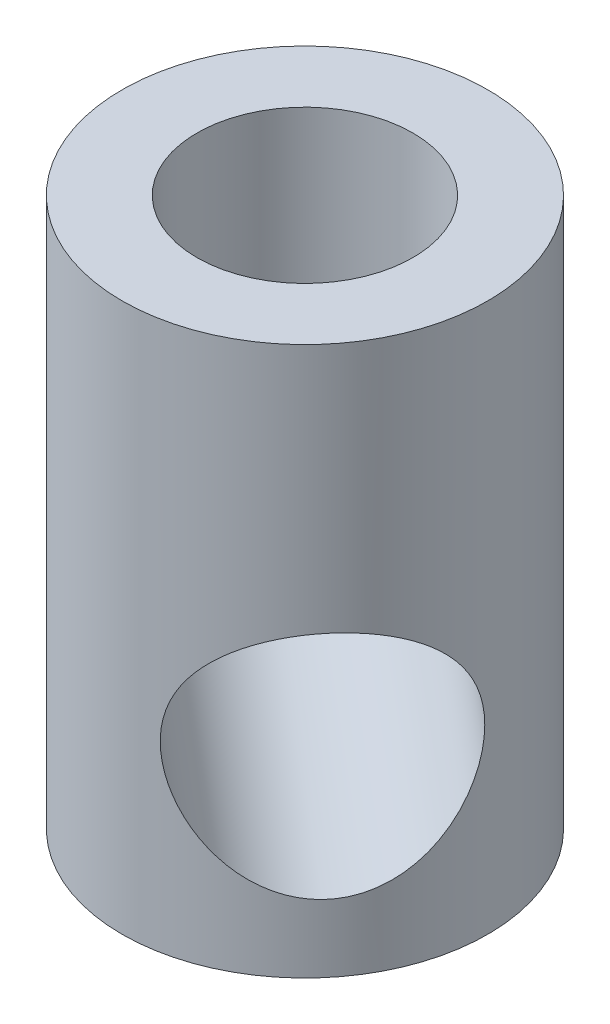
ISO-10303-21;
HEADER;
FILE_DESCRIPTION(('STEP AP214'),'2;1');
FILE_NAME('part.step','',(''),(''),'','','');
FILE_SCHEMA(('AUTOMOTIVE_DESIGN { 1 0 10303 214 1 1 1 1 }'));
ENDSEC;
DATA;
#1=APPLICATION_CONTEXT('core data for automotive mechanical design processes');
#2=APPLICATION_PROTOCOL_DEFINITION('international standard','automotive_design',2000,#1);
#3=PRODUCT_CONTEXT('',#1,'mechanical');
#4=PRODUCT('Part','Part','',(#3));
#5=PRODUCT_RELATED_PRODUCT_CATEGORY('part','',(#4));
#6=PRODUCT_DEFINITION_FORMATION('','',#4);
#7=PRODUCT_DEFINITION_CONTEXT('part definition',#1,'design');
#8=PRODUCT_DEFINITION('design','',#6,#7);
#9=PRODUCT_DEFINITION_SHAPE('','',#8);
#10=(LENGTH_UNIT() NAMED_UNIT(*) SI_UNIT(.MILLI.,.METRE.));
#11=(NAMED_UNIT(*) PLANE_ANGLE_UNIT() SI_UNIT($,.RADIAN.));
#12=(NAMED_UNIT(*) SI_UNIT($,.STERADIAN.) SOLID_ANGLE_UNIT());
#13=UNCERTAINTY_MEASURE_WITH_UNIT(LENGTH_MEASURE(1.E-05),#10,'distance_accuracy_value','');
#14=(GEOMETRIC_REPRESENTATION_CONTEXT(3) GLOBAL_UNCERTAINTY_ASSIGNED_CONTEXT((#13)) GLOBAL_UNIT_ASSIGNED_CONTEXT((#10,
#11,#12)) REPRESENTATION_CONTEXT('',''));
#15=CARTESIAN_POINT('',(0.,0.,0.));
#16=DIRECTION('',(0.,0.,1.));
#17=DIRECTION('',(1.,0.,0.));
#18=AXIS2_PLACEMENT_3D('',#15,#16,#17);
#19=CARTESIAN_POINT('',(0.,76.2,0.));
#20=DIRECTION('',(0.,-1.,0.));
#21=DIRECTION('',(0.,0.,-1.));
#22=AXIS2_PLACEMENT_3D('',#19,#20,#21);
#23=CYLINDRICAL_SURFACE('',#22,25.4);
#24=CARTESIAN_POINT('',(-4.83356462815564,25.4,-24.9358507572018));
#25=CARTESIAN_POINT('',(-4.83357110868938,25.7969701139524,-24.9358516920999));
#26=CARTESIAN_POINT('',(-4.85229699139434,26.1939988397188,-24.9322421428112));
#27=CARTESIAN_POINT('',(-4.92660675670398,26.9846220584306,-24.9176629867704));
#28=CARTESIAN_POINT('',(-4.98221122666198,27.3782145086725,-24.9066892689545));
#29=CARTESIAN_POINT('',(-5.1286808126733,28.1593589895148,-24.8769411940413));
#30=CARTESIAN_POINT('',(-5.21962459802844,28.5468955226079,-24.8581494264433));
#31=CARTESIAN_POINT('',(-5.43412762537878,29.3122231946948,-24.8121391128153));
#32=CARTESIAN_POINT('',(-5.55768383995179,29.6900152347016,-24.7849213489326));
#33=CARTESIAN_POINT('',(-5.83308184477297,30.4304631129457,-24.7215475140373));
#34=CARTESIAN_POINT('',(-5.98466226425741,30.793223694934,-24.6854731011177));
#35=CARTESIAN_POINT('',(-6.31368416263039,31.5056677590574,-24.6033762988365));
#36=CARTESIAN_POINT('',(-6.49112940940701,31.85534932655,-24.5573524596084));
#37=CARTESIAN_POINT('',(-6.86875277072241,32.5404197543147,-24.4544170263019));
#38=CARTESIAN_POINT('',(-7.06892660011471,32.8758112924216,-24.3975074831855));
#39=CARTESIAN_POINT('',(-7.4891621917344,33.5315565054309,-24.2718057514499));
#40=CARTESIAN_POINT('',(-7.70922514024445,33.8519092816155,-24.2030128538269));
#41=CARTESIAN_POINT('',(-8.19784664213237,34.5195857603469,-24.0422578217027));
#42=CARTESIAN_POINT('',(-8.46892352195738,34.8646165945116,-23.948414454026));
#43=CARTESIAN_POINT('',(-9.0298188052743,35.5333887068003,-23.7426121334703));
#44=CARTESIAN_POINT('',(-9.31963840772424,35.8571286202829,-23.6306520209872));
#45=CARTESIAN_POINT('',(-9.91501776064366,36.4825181563404,-23.387089334142));
#46=CARTESIAN_POINT('',(-10.2205902711803,36.7841493760242,-23.2554706670264));
#47=CARTESIAN_POINT('',(-10.8441881440258,37.3637986446783,-22.971308480158));
#48=CARTESIAN_POINT('',(-11.1622142306806,37.64181531715,-22.8187637419721));
#49=CARTESIAN_POINT('',(-11.8476176693465,38.2055924750291,-22.4712972093967));
#50=CARTESIAN_POINT('',(-12.2162384320263,38.4880671533355,-22.2734683612964));
#51=CARTESIAN_POINT('',(-12.9611157483304,39.0189561546074,-21.8484177778527));
#52=CARTESIAN_POINT('',(-13.3373730874943,39.2673669529827,-21.6211930056328));
#53=CARTESIAN_POINT('',(-14.0926789533767,39.7271905766952,-21.1366395540882));
#54=CARTESIAN_POINT('',(-14.4717251367174,39.9386314287114,-20.879333927968));
#55=CARTESIAN_POINT('',(-15.2280272156126,40.321809162218,-20.3343132081772));
#56=CARTESIAN_POINT('',(-15.6052834304611,40.4935534072534,-20.046603768731));
#57=CARTESIAN_POINT('',(-16.3144605923239,40.7790420925276,-19.4726620950219));
#58=CARTESIAN_POINT('',(-16.6470534241127,40.8969352110509,-19.1893216868604));
#59=CARTESIAN_POINT('',(-17.3029568569943,41.0967049481654,-18.6000525064745));
#60=CARTESIAN_POINT('',(-17.626268034853,41.1785838092453,-18.294125142051));
#61=CARTESIAN_POINT('',(-18.259599831713,41.3048768019116,-17.662021587174));
#62=CARTESIAN_POINT('',(-18.5696321055775,41.3493244540177,-17.335863795223));
#63=CARTESIAN_POINT('',(-19.1732300686264,41.4000663789218,-16.6658472634768));
#64=CARTESIAN_POINT('',(-19.4667976954769,41.4063651507011,-16.3219906157703));
#65=CARTESIAN_POINT('',(-19.9957094902914,41.3824694414227,-15.6679183968568));
#66=CARTESIAN_POINT('',(-20.2335325332917,41.3571370267239,-15.3595143476957));
#67=CARTESIAN_POINT('',(-20.6931164295641,41.2783153401797,-14.7344951007209));
#68=CARTESIAN_POINT('',(-20.9148791149039,41.2248292857032,-14.417880845091));
#69=CARTESIAN_POINT('',(-21.3412167749143,41.0904015030142,-13.7789693368856));
#70=CARTESIAN_POINT('',(-21.5457910511632,41.0094586598145,-13.4566718540249));
#71=CARTESIAN_POINT('',(-21.9370363329573,40.821109904863,-12.8089658249773));
#72=CARTESIAN_POINT('',(-22.12370658128,40.7137028745355,-12.483557147847));
#73=CARTESIAN_POINT('',(-22.4791435272437,40.4734160816423,-11.8315772891627));
#74=CARTESIAN_POINT('',(-22.6478781179513,40.3404917948212,-11.5050050695704));
#75=CARTESIAN_POINT('',(-22.9671384354731,40.0506177858234,-10.8536680760008));
#76=CARTESIAN_POINT('',(-23.1176643955864,39.8936683715284,-10.5289032789167));
#77=CARTESIAN_POINT('',(-23.4009165741078,39.5570829578164,-9.88338773974021));
#78=CARTESIAN_POINT('',(-23.5336415013324,39.3774453145602,-9.56263729035353));
#79=CARTESIAN_POINT('',(-23.7819463313254,38.9967941391865,-8.92722880049427));
#80=CARTESIAN_POINT('',(-23.8975243351405,38.7957782437387,-8.61257143815688));
#81=CARTESIAN_POINT('',(-24.1258501102164,38.3471353586455,-7.95236740412718));
#82=CARTESIAN_POINT('',(-24.2364274574704,38.0968241101426,-7.60789227767819));
#83=CARTESIAN_POINT('',(-24.4383876768032,37.5722615131688,-6.9317903752812));
#84=CARTESIAN_POINT('',(-24.5297691756562,37.2980084539426,-6.60016451992277));
#85=CARTESIAN_POINT('',(-24.6950778747488,36.7265244837773,-5.95190435537781));
#86=CARTESIAN_POINT('',(-24.7689808463942,36.4292624263081,-5.63529133699881));
#87=CARTESIAN_POINT('',(-24.9009377548053,35.8132439313812,-5.02018547791709));
#88=CARTESIAN_POINT('',(-24.95899090961,35.4944864343993,-4.72169353179396));
#89=CARTESIAN_POINT('',(-25.0679413353096,34.7924476823545,-4.10709850134627));
#90=CARTESIAN_POINT('',(-25.1168450097668,34.4062368028095,-3.79397412893544));
#91=CARTESIAN_POINT('',(-25.1995284034067,33.6087408251449,-3.19906287851973));
#92=CARTESIAN_POINT('',(-25.2333052142372,33.197450922486,-2.91728203456973));
#93=CARTESIAN_POINT('',(-25.288642654284,32.3518135505226,-2.39052200180217));
#94=CARTESIAN_POINT('',(-25.310221402319,31.9175013334537,-2.14548862874852));
#95=CARTESIAN_POINT('',(-25.3357089731511,31.250132211402,-1.8095499936449));
#96=CARTESIAN_POINT('',(-25.3430575902883,31.0250543866432,-1.70285020808978));
#97=CARTESIAN_POINT('',(-25.355834135446,30.5697907227153,-1.50064441219711));
#98=CARTESIAN_POINT('',(-25.3612615836511,30.3396036227289,-1.40514120220148));
#99=CARTESIAN_POINT('',(-25.3727200203615,29.7658081418069,-1.18423915643742));
#100=CARTESIAN_POINT('',(-25.3778466670599,29.4194908398704,-1.06574084728149));
#101=CARTESIAN_POINT('',(-25.3857588454689,28.7185291953374,-0.856849960434379));
#102=CARTESIAN_POINT('',(-25.3885449527903,28.3638869221752,-0.766450475823772));
#103=CARTESIAN_POINT('',(-25.3926465692204,27.6486405638016,-0.615789574174001));
#104=CARTESIAN_POINT('',(-25.393963788538,27.2880439088767,-0.555493153786032));
#105=CARTESIAN_POINT('',(-25.3957578040442,26.5629544351121,-0.466358401628184));
#106=CARTESIAN_POINT('',(-25.396234587949,26.1984615594039,-0.437520529656163));
#107=CARTESIAN_POINT('',(-25.3966612931863,25.4674258044397,-0.412025256489904));
#108=CARTESIAN_POINT('',(-25.3966098869564,25.1008800751345,-0.415448940262638));
#109=CARTESIAN_POINT('',(-25.3959392719185,24.3695258520185,-0.454579796326619));
#110=CARTESIAN_POINT('',(-25.3953200599125,24.0047173680041,-0.490287150451674));
#111=CARTESIAN_POINT('',(-25.393126291467,23.2793121056182,-0.593095138762938));
#112=CARTESIAN_POINT('',(-25.3915510491342,22.9187185406846,-0.660218303954974));
#113=CARTESIAN_POINT('',(-25.3867550642872,22.2044125161375,-0.824243979473491));
#114=CARTESIAN_POINT('',(-25.3835342823085,21.8507002217666,-0.921147203983671));
#115=CARTESIAN_POINT('',(-25.3746175836793,21.159188527585,-1.14041184979749));
#116=CARTESIAN_POINT('',(-25.368973073702,20.8212119575188,-1.26221840684765));
#117=CARTESIAN_POINT('',(-25.3542181265306,20.1551187685649,-1.53024904916659));
#118=CARTESIAN_POINT('',(-25.345106319506,19.8270061019762,-1.67648277208754));
#119=CARTESIAN_POINT('',(-25.3109307950322,18.8592035136033,-2.1485067205967));
#120=CARTESIAN_POINT('',(-25.2790245779965,18.2356842864005,-2.5077391681674));
#121=CARTESIAN_POINT('',(-25.2065013788639,17.2808846481442,-3.1382540286622));
#122=CARTESIAN_POINT('',(-25.1745973093835,16.9332232354086,-3.38651693367987));
#123=CARTESIAN_POINT('',(-25.0992961571556,16.2563475793921,-3.90564568831581));
#124=CARTESIAN_POINT('',(-25.0558980154446,15.9271350392169,-4.17651361898812));
#125=CARTESIAN_POINT('',(-24.9557751385382,15.2878571864987,-4.73822409139262));
#126=CARTESIAN_POINT('',(-24.8990379109726,14.9778101687917,-5.02908517538569));
#127=CARTESIAN_POINT('',(-24.7705356362195,14.3780728486242,-5.62799996288085));
#128=CARTESIAN_POINT('',(-24.6987696147462,14.0883838675601,-5.93605478006706));
#129=CARTESIAN_POINT('',(-24.525194495483,13.4838484145859,-6.61959306856572));
#130=CARTESIAN_POINT('',(-24.4203703747285,13.1728716788077,-6.99774979346343));
#131=CARTESIAN_POINT('',(-24.1856211370612,12.5820846637365,-7.77037768297951));
#132=CARTESIAN_POINT('',(-24.0556929962199,12.3022781454894,-8.16485080850195));
#133=CARTESIAN_POINT('',(-23.7686900749878,11.7762962501508,-8.96606813603458));
#134=CARTESIAN_POINT('',(-23.6116221273759,11.5301124359953,-9.37280922820961));
#135=CARTESIAN_POINT('',(-23.2686898637456,11.07399230703,-10.1944171372001));
#136=CARTESIAN_POINT('',(-23.0828290971513,10.8640515311087,-10.6092829469445));
#137=CARTESIAN_POINT('',(-22.6926341670077,10.4939714072506,-11.4190543205665));
#138=CARTESIAN_POINT('',(-22.4899327631162,10.3316913075233,-11.8137662127119));
#139=CARTESIAN_POINT('',(-22.0578257259364,10.0442421988816,-12.6021551011482));
#140=CARTESIAN_POINT('',(-21.8284206323575,9.91907244010991,-12.9958321181907));
#141=CARTESIAN_POINT('',(-21.3438501976789,9.70805719879916,-13.777195945703));
#142=CARTESIAN_POINT('',(-21.0887160123891,9.6221648361641,-14.1648893608703));
#143=CARTESIAN_POINT('',(-20.5540252057399,9.4910878390554,-14.9301635500069));
#144=CARTESIAN_POINT('',(-20.274472818955,9.44589616163355,-15.3077460626158));
#145=CARTESIAN_POINT('',(-19.7371617579449,9.40075203029698,-15.9926382481116));
#146=CARTESIAN_POINT('',(-19.4824503768112,9.39501705401823,-16.3019749032384));
#147=CARTESIAN_POINT('',(-18.9591585746058,9.41361301003928,-16.9077029217828));
#148=CARTESIAN_POINT('',(-18.6905798344993,9.43794030642899,-17.2040958462037));
#149=CARTESIAN_POINT('',(-18.1418432901156,9.51630476627944,-17.781795693086));
#150=CARTESIAN_POINT('',(-17.8616861257396,9.57034028989005,-18.0631034472859));
#151=CARTESIAN_POINT('',(-17.2922730358728,9.70736981285944,-18.6089452446584));
#152=CARTESIAN_POINT('',(-17.0030169416751,9.79036434944705,-18.8734789765426));
#153=CARTESIAN_POINT('',(-16.4294083860612,9.98046120410577,-19.3745688345557));
#154=CARTESIAN_POINT('',(-16.1453024551561,10.0865008768068,-19.6118128163011));
#155=CARTESIAN_POINT('',(-15.5734372144104,10.3231749051981,-20.068932561953));
#156=CARTESIAN_POINT('',(-15.2856780575358,10.4538082342628,-20.288809050296));
#157=CARTESIAN_POINT('',(-14.7087558823699,10.738413182725,-20.7108730539277));
#158=CARTESIAN_POINT('',(-14.4195928362758,10.8923852661651,-20.9130602173751));
#159=CARTESIAN_POINT('',(-13.8420119242392,11.2223879033501,-21.2997541447266));
#160=CARTESIAN_POINT('',(-13.5535941548593,11.3984211822748,-21.484258719355));
#161=CARTESIAN_POINT('',(-12.9502024121339,11.7903749356917,-21.8538302071843));
#162=CARTESIAN_POINT('',(-12.6355327717233,12.0085339464682,-22.0370207102081));
#163=CARTESIAN_POINT('',(-12.0122956079311,12.4685454655425,-22.3828459731876));
#164=CARTESIAN_POINT('',(-11.7037284324021,12.7103993198412,-22.5454795641914));
#165=CARTESIAN_POINT('',(-11.0949641056901,13.2166393231634,-22.8512121508947));
#166=CARTESIAN_POINT('',(-10.7947754175782,13.4810472333067,-22.9942919259225));
#167=CARTESIAN_POINT('',(-10.2056135719699,14.0309815908381,-23.2617742956198));
#168=CARTESIAN_POINT('',(-9.91664139519483,14.3165098785833,-23.3861752598134));
#169=CARTESIAN_POINT('',(-9.31098556243876,14.9511658712403,-23.6344623842019));
#170=CARTESIAN_POINT('',(-8.99648336061249,15.3034689211912,-23.7555777953249));
#171=CARTESIAN_POINT('',(-8.38980563135214,16.0331956447043,-23.9765597548511));
#172=CARTESIAN_POINT('',(-8.09763416562886,16.4106238650061,-24.0764224434888));
#173=CARTESIAN_POINT('',(-7.5403342701358,17.1892039208907,-24.256733290522));
#174=CARTESIAN_POINT('',(-7.27519805837422,17.5903488768817,-24.3371870448627));
#175=CARTESIAN_POINT('',(-6.77703812991623,18.4150390393904,-24.4805828561192));
#176=CARTESIAN_POINT('',(-6.54400465256015,18.8385773828845,-24.5435302417067));
#177=CARTESIAN_POINT('',(-6.16240644214175,19.6115207559117,-24.6417260082817));
#178=CARTESIAN_POINT('',(-6.00650678387351,19.9569291553259,-24.6800213238655));
#179=CARTESIAN_POINT('',(-5.7205434681927,20.659181641865,-24.7478684994701));
#180=CARTESIAN_POINT('',(-5.59047982238856,21.016025734128,-24.7774203555624));
#181=CARTESIAN_POINT('',(-5.35930652623294,21.7384973156937,-24.8284480360507));
#182=CARTESIAN_POINT('',(-5.25811917804193,22.1040983100572,-24.8499455820612));
#183=CARTESIAN_POINT('',(-5.08677370225928,22.8427297201939,-24.8855869007646));
#184=CARTESIAN_POINT('',(-5.0166003382938,23.2157563935803,-24.8997342850043));
#185=CARTESIAN_POINT('',(-4.92005085352286,23.890541791626,-24.9189680774198));
#186=CARTESIAN_POINT('',(-4.88767974204558,24.1914171499132,-24.9253099810483));
#187=CARTESIAN_POINT('',(-4.84443130106313,24.794850036396,-24.9337515287881));
#188=CARTESIAN_POINT('',(-4.83355968834365,25.0974079905582,-24.9358500445721));
#189=CARTESIAN_POINT('',(-4.83356462815564,25.4,-24.9358507572018));
#190=B_SPLINE_CURVE_WITH_KNOTS('',3,(#24,#25,#26,#27,#28,#29,#30,#31,#32,#33,#34,#35,#36,#37,
#38,#39,#40,#41,#42,#43,#44,#45,#46,#47,#48,#49,#50,#51,#52,#53,#54,#55,#56,#57,#58,#59,#60,#61,
#62,#63,#64,#65,#66,#67,#68,#69,#70,#71,#72,#73,#74,#75,#76,#77,#78,#79,#80,#81,#82,#83,#84,#85,
#86,#87,#88,#89,#90,#91,#92,#93,#94,#95,#96,#97,#98,#99,#100,#101,#102,#103,#104,#105,#106,#107,
#108,#109,#110,#111,#112,#113,#114,#115,#116,#117,#118,#119,#120,#121,#122,#123,#124,#125,#126,
#127,#128,#129,#130,#131,#132,#133,#134,#135,#136,#137,#138,#139,#140,#141,#142,#143,#144,#145,
#146,#147,#148,#149,#150,#151,#152,#153,#154,#155,#156,#157,#158,#159,#160,#161,#162,#163,#164,
#165,#166,#167,#168,#169,#170,#171,#172,#173,#174,#175,#176,#177,#178,#179,#180,#181,#182,#183,
#184,#185,#186,#187,#188,#189),.UNSPECIFIED.,.T.,.F.,(4,2,2,2,2,2,2,2,2,2,2,2,2,2,2,2,2,2,2,2,2,
2,2,2,2,2,2,2,2,2,2,2,2,2,2,2,2,2,2,2,2,2,2,2,2,2,2,2,2,2,2,2,2,2,2,2,2,2,2,2,2,2,2,2,2,2,2,2,2,
2,2,2,2,2,2,2,2,2,2,2,2,2,4),(0.,1.19056192643151,2.38178904030105,3.57568329354925,
4.76946675616906,5.95263172347253,7.13596922225326,8.31908398910847,9.50226936924274,
10.8470672235169,12.191951188766,13.5379421898891,14.8840115954402,16.3963600748376,
17.9088649190685,19.4202181241988,20.9312907546041,22.2869408986004,23.6425066187845,
24.9968571034768,26.3510478635325,27.5204656677657,28.6897498611405,29.8590815434274,
31.0284626589486,32.1999030479051,33.3713284261231,34.5428387268263,35.714478670931,
37.0329697131235,38.3515550449541,39.6719576143442,40.992425314884,42.4893879884277,
43.9866383506628,45.4816588360723,46.228985130794,46.9764979400993,48.0735221652448,
49.1702765192812,50.2657525977321,51.3612446874368,52.4594908782269,53.5577432547924,
54.6567844932901,55.7558520909898,56.8326785553955,57.909930885752,60.0632944153162,
61.3475635668853,62.631951080985,63.9175462799723,65.2032248472583,66.7034662389385,
68.2038884564069,69.7039334731365,71.2037937193031,72.6190753715489,74.034328424442,
75.4478878444004,76.8612026114818,78.0619197275275,79.2624916359149,80.4629972811639,
81.6635251985991,82.8173814707339,83.9711895875332,85.1250206484133,86.2789943807127,
87.5511140325928,88.8233059900045,90.0967396058669,91.3702843153708,92.8312766215038,
94.2925340364777,95.7533696397694,97.2137600991014,98.3553966377143,99.497033689277,
100.635569318127,101.773544990232,102.680814224168,103.588324671484),.UNSPECIFIED.);
#191=CARTESIAN_POINT('',(-4.83356462815564,25.4,-24.9358507572018));
#192=VERTEX_POINT('',#191);
#193=EDGE_CURVE('E33',#192,#192,#190,.T.);
#194=ORIENTED_EDGE('',*,*,#193,.T.);
#195=EDGE_LOOP('',(#194));
#196=FACE_BOUND('',#195,.T.);
#197=CARTESIAN_POINT('',(25.3965729547541,25.4,0.417231535062922));
#198=CARTESIAN_POINT('',(25.3965750039251,25.0030298860476,0.417237753764598));
#199=CARTESIAN_POINT('',(25.3962816442836,24.6060011602812,0.436306090589518));
#200=CARTESIAN_POINT('',(25.3948659988879,23.8153779415694,0.51201929260441));
#201=CARTESIAN_POINT('',(25.3937432500899,23.4217854913275,0.568685146495012));
#202=CARTESIAN_POINT('',(25.3899568041346,22.6406410104852,0.718097162124252));
#203=CARTESIAN_POINT('',(25.3872896624459,22.2531044773921,0.810923823054135));
#204=CARTESIAN_POINT('',(25.3793372102136,21.4877768053052,1.03016172170787));
#205=CARTESIAN_POINT('',(25.3740521426529,21.1099847652984,1.15656984206122));
#206=CARTESIAN_POINT('',(25.3596060952922,20.3695368870543,1.43879602037299));
#207=CARTESIAN_POINT('',(25.3504800091978,20.006776305066,1.59434248092794));
#208=CARTESIAN_POINT('',(25.3269354638302,19.2943322409426,1.93263370005308));
#209=CARTESIAN_POINT('',(25.3125162330066,18.94465067345,2.11538242142583));
#210=CARTESIAN_POINT('',(25.2769152180387,18.2595802456853,2.50516142826737));
#211=CARTESIAN_POINT('',(25.2557347072766,17.9241887075785,2.71218713690074));
#212=CARTESIAN_POINT('',(25.2051360101563,17.2684434945691,3.14789191042868));
#213=CARTESIAN_POINT('',(25.1757173322143,16.9480907183845,3.3765722669494));
#214=CARTESIAN_POINT('',(25.1025100781004,16.2804142396531,3.88572239255634));
#215=CARTESIAN_POINT('',(25.057307570414,15.9353834054884,4.16899961672277));
#216=CARTESIAN_POINT('',(24.9523275374728,15.2666112931997,4.75716397017928));
#217=CARTESIAN_POINT('',(24.8925490791264,14.9428713797171,5.06205248204745));
#218=CARTESIAN_POINT('',(24.7563909218771,14.3174818436596,5.69074979595973));
#219=CARTESIAN_POINT('',(24.6799975982335,14.0158506239758,6.01457396558215));
#220=CARTESIAN_POINT('',(24.50877444565,13.4362013553217,6.67812885214586));
#221=CARTESIAN_POINT('',(24.4139435430367,13.15818468285,7.01786049455011));
#222=CARTESIAN_POINT('',(24.1911465280597,12.5944075249709,7.75330074032973));
#223=CARTESIAN_POINT('',(24.0605343169967,12.3119328466646,8.15074000630705));
#224=CARTESIAN_POINT('',(23.7716958763967,11.7810438453926,8.9582563033946));
#225=CARTESIAN_POINT('',(23.6134667931857,11.5326330470173,9.36833463690088));
#226=CARTESIAN_POINT('',(23.2678507852054,11.0728094233048,10.1964823130238));
#227=CARTESIAN_POINT('',(23.080486153295,10.8613685712886,10.6145453334494));
#228=CARTESIAN_POINT('',(22.6755003114379,10.478190837782,11.4542041257203));
#229=CARTESIAN_POINT('',(22.4578847249221,10.3064465927466,11.875799227321));
#230=CARTESIAN_POINT('',(22.0162132352451,10.0209579074724,12.6740896424797));
#231=CARTESIAN_POINT('',(21.7951219766567,9.90306478894907,13.0509429747327));
#232=CARTESIAN_POINT('',(21.3290797864578,9.70329505183463,13.7994429127241));
#233=CARTESIAN_POINT('',(21.0841303415781,9.62141619075466,14.1710898412525));
#234=CARTESIAN_POINT('',(20.5719775345545,9.49512319808838,14.9048224705255));
#235=CARTESIAN_POINT('',(20.3047943194278,9.45067554598232,15.2669164440221));
#236=CARTESIAN_POINT('',(19.7501298263758,9.39993362107819,15.977971965031));
#237=CARTESIAN_POINT('',(19.4626509460083,9.3936348492989,16.3269350562731));
#238=CARTESIAN_POINT('',(18.9106808463478,9.41753055857734,16.9616689874042));
#239=CARTESIAN_POINT('',(18.6484051546653,9.44286297327607,17.2495653556921));
#240=CARTESIAN_POINT('',(18.1129709260001,9.52168465982031,17.8109712726324));
#241=CARTESIAN_POINT('',(17.8398136358515,9.57517071429685,18.0844824612807));
#242=CARTESIAN_POINT('',(17.2849097266328,9.70959849698581,18.6155694289181));
#243=CARTESIAN_POINT('',(17.0031627591691,9.79054134018546,18.8731445602607));
#244=CARTESIAN_POINT('',(16.4334875176194,9.97889009513696,19.3712068954718));
#245=CARTESIAN_POINT('',(16.1455589827235,10.0862971254644,19.6116933764917));
#246=CARTESIAN_POINT('',(15.5654393422135,10.3265839183577,20.0752388018605));
#247=CARTESIAN_POINT('',(15.2732416231321,10.4595082051788,20.2982663106445));
#248=CARTESIAN_POINT('',(14.6874550140172,10.7493822141766,20.7260759390051));
#249=CARTESIAN_POINT('',(14.393866141858,10.9063316284716,20.9308582923401));
#250=CARTESIAN_POINT('',(13.8075413656183,11.2429170421836,21.3221962086258));
#251=CARTESIAN_POINT('',(13.5148055249167,11.4225546854398,21.5087504491492));
#252=CARTESIAN_POINT('',(12.9323474242963,11.8032058608135,21.8639149161287));
#253=CARTESIAN_POINT('',(12.6426255014558,12.0042217562613,22.0325231545532));
#254=CARTESIAN_POINT('',(12.0322714658888,12.4528646413545,22.3723318910214));
#255=CARTESIAN_POINT('',(11.71231655466,12.7031758898574,22.5412085242433));
#256=CARTESIAN_POINT('',(11.0817161194863,13.2277384868312,22.8578231224166));
#257=CARTESIAN_POINT('',(10.7710712629225,13.5019915460574,23.0055595748085));
#258=CARTESIAN_POINT('',(10.161504429004,14.0734755162227,23.2812341690642));
#259=CARTESIAN_POINT('',(9.86259919782053,14.3707375736919,23.4091447448437));
#260=CARTESIAN_POINT('',(9.27987199031649,14.9867560686187,23.6462034826886));
#261=CARTESIAN_POINT('',(8.99605075873092,15.3055135656007,23.7553507189542));
#262=CARTESIAN_POINT('',(8.4098200902431,16.0075523176455,23.9696655575339));
#263=CARTESIAN_POINT('',(8.1099966735382,16.3937631971904,24.072351295436));
#264=CARTESIAN_POINT('',(7.53857471896888,17.191259174855,24.2573726166159));
#265=CARTESIAN_POINT('',(7.26698161648063,17.602549077514,24.3397042851758));
#266=CARTESIAN_POINT('',(6.75790733475273,18.4481864494774,24.4859292491028));
#267=CARTESIAN_POINT('',(6.52037595453698,18.8824986665463,24.5498498223919));
#268=CARTESIAN_POINT('',(6.19400906225741,19.549867788598,24.6334502676418));
#269=CARTESIAN_POINT('',(6.09021939512831,19.7749456133568,24.6592679245566));
#270=CARTESIAN_POINT('',(5.89332831360972,20.2302092772847,24.707062547865));
#271=CARTESIAN_POINT('',(5.80022957321469,20.4603963772711,24.729038554107));
#272=CARTESIAN_POINT('',(5.58469837988394,21.0341918581931,24.7787910846558));
#273=CARTESIAN_POINT('',(5.46890352519085,21.3805091601296,24.8044753873676));
#274=CARTESIAN_POINT('',(5.26458239239653,22.0814708046626,24.8486441531257));
#275=CARTESIAN_POINT('',(5.17604941315477,22.4361130778248,24.8671303857989));
#276=CARTESIAN_POINT('',(5.02840490990756,23.1513594361984,24.89740630369));
#277=CARTESIAN_POINT('',(4.96925921523499,23.5119560911232,24.9092037686733));
#278=CARTESIAN_POINT('',(4.88179887446589,24.2370455648879,24.9264928208865));
#279=CARTESIAN_POINT('',(4.85348467900229,24.6015384405961,24.9319843159485));
#280=CARTESIAN_POINT('',(4.82845328599224,25.3325741955603,24.9368443977541));
#281=CARTESIAN_POINT('',(4.83181570323407,25.6991199248654,24.9361975566083));
#282=CARTESIAN_POINT('',(4.87023184971755,26.4304741479815,24.9287227114467));
#283=CARTESIAN_POINT('',(4.90528575745761,26.7952826319959,24.9218946726162));
#284=CARTESIAN_POINT('',(5.00614079016909,27.5206878943818,24.9018308380533));
#285=CARTESIAN_POINT('',(5.07196398242403,27.8812814593154,24.8885904432264));
#286=CARTESIAN_POINT('',(5.23264812260366,28.5955874838624,24.8553033467069));
#287=CARTESIAN_POINT('',(5.32750976692664,28.9492997782334,24.8352564817808));
#288=CARTESIAN_POINT('',(5.54187121320332,29.640811472415,24.7882919976628));
#289=CARTESIAN_POINT('',(5.66083358156399,29.9787880424812,24.7615216269647));
#290=CARTESIAN_POINT('',(5.92219916646107,30.6448812314351,24.7003157063414));
#291=CARTESIAN_POINT('',(6.06461163483469,30.9729938980238,24.6658771291596));
#292=CARTESIAN_POINT('',(6.52347146735181,31.9407964863967,24.55002278724));
#293=CARTESIAN_POINT('',(6.87165845874834,32.5643157135995,24.456045252183));
#294=CARTESIAN_POINT('',(7.47990935142577,33.5191153518558,24.2748286545042));
#295=CARTESIAN_POINT('',(7.71882280377427,33.8667767645914,24.2001781223952));
#296=CARTESIAN_POINT('',(8.21690581617765,34.5436524206079,24.035623450107));
#297=CARTESIAN_POINT('',(8.47607724107366,34.8728649607831,23.9457179047383));
#298=CARTESIAN_POINT('',(9.01176871588767,35.5121428135013,23.7493053565127));
#299=CARTESIAN_POINT('',(9.28830484924354,35.8221898312083,23.6427828231123));
#300=CARTESIAN_POINT('',(9.85568999711482,36.4219271513758,23.4119455400054));
#301=CARTESIAN_POINT('',(10.1465399386293,36.7116161324398,23.2876296369568));
#302=CARTESIAN_POINT('',(10.7894062790457,37.3161515854141,22.9976713947382));
#303=CARTESIAN_POINT('',(11.1435300300435,37.6271283211923,22.828594566472));
#304=CARTESIAN_POINT('',(11.8634714499624,38.2179153362635,22.4628823679762));
#305=CARTESIAN_POINT('',(12.22929052322,38.4977218545106,22.2662436785408));
#306=CARTESIAN_POINT('',(12.9682847671985,39.0237037498492,21.8440975070541));
#307=CARTESIAN_POINT('',(13.3414580655032,39.2698875640047,21.6185972949408));
#308=CARTESIAN_POINT('',(14.0907914557844,39.72600769297,21.1378254532487));
#309=CARTESIAN_POINT('',(14.4669511741957,39.9359484688913,20.8825574942358));
#310=CARTESIAN_POINT('',(15.1963982944924,40.3060285927494,20.3573064497453));
#311=CARTESIAN_POINT('',(15.5497793223368,40.4683086924767,20.0889649022723));
#312=CARTESIAN_POINT('',(16.2508718640951,40.7557578011184,19.5261658449872));
#313=CARTESIAN_POINT('',(16.5985834924316,40.8809275598901,19.2317088630238));
#314=CARTESIAN_POINT('',(17.2836220328201,41.0919428012008,18.6184714413903));
#315=CARTESIAN_POINT('',(17.6209608743048,41.1778351638359,18.2997205312844));
#316=CARTESIAN_POINT('',(18.2814273720664,41.3089121609446,17.6399305278679));
#317=CARTESIAN_POINT('',(18.60455747785,41.3541038383664,17.2988953016501));
#318=CARTESIAN_POINT('',(19.1854139132932,41.399247969703,16.6505232761575));
#319=CARTESIAN_POINT('',(19.4456669261568,41.4049829459818,16.3458342163286));
#320=CARTESIAN_POINT('',(19.9510102298607,41.3863869899607,15.7250533466919));
#321=CARTESIAN_POINT('',(20.1961023505849,41.362059693571,15.4089629203218));
#322=CARTESIAN_POINT('',(20.6694146599362,41.2836952337206,14.7680070980949));
#323=CARTESIAN_POINT('',(20.8976357790287,41.2296597101099,14.4431421875176));
#324=CARTESIAN_POINT('',(21.3359760990184,41.0926301871406,13.7873737081426));
#325=CARTESIAN_POINT('',(21.5460949640042,41.009635650553,13.4564700274255));
#326=CARTESIAN_POINT('',(21.9396365372215,40.8195387958942,12.8043635552702));
#327=CARTESIAN_POINT('',(22.1237795228151,40.7134991231932,12.483283740105));
#328=CARTESIAN_POINT('',(22.4743264439897,40.4768250948019,11.8405511584717));
#329=CARTESIAN_POINT('',(22.6407311195761,40.3461917657372,11.5188984164747));
#330=CARTESIAN_POINT('',(22.9558773109028,40.061586817275,10.8772909839647));
#331=CARTESIAN_POINT('',(23.1046184753361,39.9076147338349,10.5573363273455));
#332=CARTESIAN_POINT('',(23.3848203335901,39.5776120966499,9.92123977647394));
#333=CARTESIAN_POINT('',(23.5162788884033,39.4015788177252,9.60509835856218));
#334=CARTESIAN_POINT('',(23.775125090588,39.0096250643083,8.94656717219352));
#335=CARTESIAN_POINT('',(23.9007179979075,38.7914660535318,8.60480385551762));
#336=CARTESIAN_POINT('',(24.13272482251,38.3314545344575,7.93086579591238));
#337=CARTESIAN_POINT('',(24.2391376492797,38.0896006801588,7.5986915990885));
#338=CARTESIAN_POINT('',(24.4341848039782,37.5833606768366,6.94598720390374));
#339=CARTESIAN_POINT('',(24.5228016787384,37.3189527666933,6.62546868649784));
#340=CARTESIAN_POINT('',(24.6835967761302,36.7690184091619,5.9987283614236));
#341=CARTESIAN_POINT('',(24.7557735639885,36.4834901214167,5.69250780343165));
#342=CARTESIAN_POINT('',(24.8947943621563,35.8488341287597,5.05286829436006));
#343=CARTESIAN_POINT('',(24.9592898520569,35.4965310788088,4.72207997904717));
#344=CARTESIAN_POINT('',(25.0712447528875,34.7668043552957,4.08618927004399));
#345=CARTESIAN_POINT('',(25.1187010703598,34.3893761349939,3.78109154816329));
#346=CARTESIAN_POINT('',(25.1992052648809,33.6107960791094,3.20090687951119));
#347=CARTESIAN_POINT('',(25.2322572971661,33.2096511231183,2.92581129514713));
#348=CARTESIAN_POINT('',(25.2867095039875,32.3849609606096,2.41029152813575));
#349=CARTESIAN_POINT('',(25.3081132259939,31.9614226171155,2.16985680600676));
#350=CARTESIAN_POINT('',(25.3383547933954,31.1884792440883,1.77698907970581));
#351=CARTESIAN_POINT('',(25.3489156688408,30.8430708446741,1.61680261787573));
#352=CARTESIAN_POINT('',(25.3659267983481,30.140818358135,1.32339355423663));
#353=CARTESIAN_POINT('',(25.3723770505629,29.7839742658721,1.1901709645428));
#354=CARTESIAN_POINT('',(25.38236714505,29.0615026843063,0.953643767282941));
#355=CARTESIAN_POINT('',(25.3859148462693,28.6959016899428,0.8502588663812));
#356=CARTESIAN_POINT('',(25.3911724528402,27.9572702798061,0.675324783815073));
#357=CARTESIAN_POINT('',(25.3928832612019,27.5842436064197,0.603759969654736));
#358=CARTESIAN_POINT('',(25.3950094640737,26.909458208374,0.505336288350061));
#359=CARTESIAN_POINT('',(25.3956171669945,26.6085828500868,0.47235539544115));
#360=CARTESIAN_POINT('',(25.3963981891062,26.005149963604,0.428297735719871));
#361=CARTESIAN_POINT('',(25.3965713927656,25.7025920094418,0.417226794833442));
#362=CARTESIAN_POINT('',(25.3965729547541,25.4,0.417231535062922));
#363=B_SPLINE_CURVE_WITH_KNOTS('',3,(#197,#198,#199,#200,#201,#202,#203,#204,#205,#206,#207,
#208,#209,#210,#211,#212,#213,#214,#215,#216,#217,#218,#219,#220,#221,#222,#223,#224,#225,#226,
#227,#228,#229,#230,#231,#232,#233,#234,#235,#236,#237,#238,#239,#240,#241,#242,#243,#244,#245,
#246,#247,#248,#249,#250,#251,#252,#253,#254,#255,#256,#257,#258,#259,#260,#261,#262,#263,#264,
#265,#266,#267,#268,#269,#270,#271,#272,#273,#274,#275,#276,#277,#278,#279,#280,#281,#282,#283,
#284,#285,#286,#287,#288,#289,#290,#291,#292,#293,#294,#295,#296,#297,#298,#299,#300,#301,#302,
#303,#304,#305,#306,#307,#308,#309,#310,#311,#312,#313,#314,#315,#316,#317,#318,#319,#320,#321,
#322,#323,#324,#325,#326,#327,#328,#329,#330,#331,#332,#333,#334,#335,#336,#337,#338,#339,#340,
#341,#342,#343,#344,#345,#346,#347,#348,#349,#350,#351,#352,#353,#354,#355,#356,#357,#358,#359,
#360,#361,#362),.UNSPECIFIED.,.T.,.F.,(4,2,2,2,2,2,2,2,2,2,2,2,2,2,2,2,2,2,2,2,2,2,2,2,2,2,2,2,
2,2,2,2,2,2,2,2,2,2,2,2,2,2,2,2,2,2,2,2,2,2,2,2,2,2,2,2,2,2,2,2,2,2,2,2,2,2,2,2,2,2,2,2,2,2,2,2,
2,2,2,2,2,2,4),(0.,1.19056192643151,2.38178904030106,3.57568329354925,4.76946675616906,
5.95263172347251,7.13596922225324,8.31908398910845,9.50226936924273,10.8470672235169,
12.191951188766,13.537942189889,14.8840115954402,16.3963600748376,17.9088649190684,
19.4202181241988,20.9312907546041,22.2869408986004,23.6425066187845,24.9968571034768,
26.3510478635325,27.5204656677657,28.6897498611405,29.8590815434274,31.0284626589486,
32.1999030479051,33.3713284261231,34.5428387268263,35.714478670931,37.0329697131235,
38.3515550449541,39.6719576143442,40.992425314884,42.4893879884277,43.9866383506628,
45.4816588360723,46.228985130794,46.9764979400993,48.0735221652448,49.1702765192812,
50.2657525977321,51.3612446874368,52.4594908782269,53.5577432547924,54.6567844932901,
55.7558520909898,56.8326785553955,57.909930885752,60.0632944153162,61.3475635668853,
62.631951080985,63.9175462799723,65.2032248472583,66.7034662389385,68.203888456407,
69.7039334731365,71.2037937193031,72.6190753715489,74.034328424442,75.4478878444003,
76.8612026114818,78.0619197275275,79.2624916359149,80.4629972811639,81.663525198599,
82.8173814707339,83.9711895875332,85.1250206484133,86.2789943807126,87.5511140325928,
88.8233059900044,90.0967396058669,91.3702843153708,92.8312766215038,94.2925340364777,
95.7533696397694,97.2137600991014,98.3553966377142,99.4970336892769,100.635569318127,
101.773544990232,102.680814224168,103.588324671484),.UNSPECIFIED.);
#364=CARTESIAN_POINT('',(25.3965729547541,25.4,0.417231535062922));
#365=VERTEX_POINT('',#364);
#366=EDGE_CURVE('E10',#365,#365,#363,.T.);
#367=ORIENTED_EDGE('',*,*,#366,.T.);
#368=EDGE_LOOP('',(#367));
#369=FACE_BOUND('',#368,.T.);
#370=CARTESIAN_POINT('',(0.,76.2,0.));
#371=DIRECTION('',(0.,1.,0.));
#372=DIRECTION('',(0.,0.,1.));
#373=AXIS2_PLACEMENT_3D('',#370,#371,#372);
#374=CIRCLE('',#373,25.4);
#375=CARTESIAN_POINT('',(0.,76.2,25.4));
#376=VERTEX_POINT('',#375);
#377=EDGE_CURVE('E40',#376,#376,#374,.T.);
#378=ORIENTED_EDGE('',*,*,#377,.F.);
#379=EDGE_LOOP('',(#378));
#380=FACE_BOUND('',#379,.T.);
#381=CARTESIAN_POINT('',(0.,0.,0.));
#382=DIRECTION('',(0.,1.,0.));
#383=DIRECTION('',(0.,0.,1.));
#384=AXIS2_PLACEMENT_3D('',#381,#382,#383);
#385=CIRCLE('',#384,25.4);
#386=CARTESIAN_POINT('',(0.,0.,25.4));
#387=VERTEX_POINT('',#386);
#388=EDGE_CURVE('E44',#387,#387,#385,.T.);
#389=ORIENTED_EDGE('',*,*,#388,.T.);
#390=EDGE_LOOP('',(#389));
#391=FACE_BOUND('',#390,.T.);
#392=ADVANCED_FACE('F29',(#196,#369,#380,#391),#23,.T.);
#393=CARTESIAN_POINT('',(0.,76.2,0.));
#394=DIRECTION('',(0.,1.,0.));
#395=DIRECTION('',(0.,0.,1.));
#396=AXIS2_PLACEMENT_3D('',#393,#394,#395);
#397=PLANE('',#396);
#398=CARTESIAN_POINT('',(0.,76.2,0.));
#399=DIRECTION('',(0.,1.,0.));
#400=DIRECTION('',(0.,0.,1.));
#401=AXIS2_PLACEMENT_3D('',#398,#399,#400);
#402=CIRCLE('',#401,15.);
#403=CARTESIAN_POINT('',(0.,76.2,15.));
#404=VERTEX_POINT('',#403);
#405=EDGE_CURVE('E84',#404,#404,#402,.T.);
#406=ORIENTED_EDGE('',*,*,#405,.F.);
#407=EDGE_LOOP('',(#406));
#408=FACE_BOUND('',#407,.T.);
#409=ORIENTED_EDGE('',*,*,#377,.T.);
#410=EDGE_LOOP('',(#409));
#411=FACE_BOUND('',#410,.T.);
#412=ADVANCED_FACE('F64',(#408,#411),#397,.T.);
#413=CARTESIAN_POINT('',(0.,0.,0.));
#414=DIRECTION('',(0.,1.,0.));
#415=DIRECTION('',(0.,0.,1.));
#416=AXIS2_PLACEMENT_3D('',#413,#414,#415);
#417=PLANE('',#416);
#418=ORIENTED_EDGE('',*,*,#388,.F.);
#419=EDGE_LOOP('',(#418));
#420=FACE_BOUND('',#419,.T.);
#421=ADVANCED_FACE('F62',(#420),#417,.F.);
#422=CARTESIAN_POINT('',(0.,50.8,0.));
#423=DIRECTION('',(0.,1.,0.));
#424=DIRECTION('',(0.,0.,1.));
#425=AXIS2_PLACEMENT_3D('',#422,#423,#424);
#426=CYLINDRICAL_SURFACE('',#425,15.);
#427=CARTESIAN_POINT('',(0.,50.8,0.));
#428=DIRECTION('',(0.,1.,0.));
#429=DIRECTION('',(0.,0.,1.));
#430=AXIS2_PLACEMENT_3D('',#427,#428,#429);
#431=CIRCLE('',#430,15.);
#432=CARTESIAN_POINT('',(0.,50.8,15.));
#433=VERTEX_POINT('',#432);
#434=EDGE_CURVE('E82',#433,#433,#431,.T.);
#435=ORIENTED_EDGE('',*,*,#434,.F.);
#436=EDGE_LOOP('',(#435));
#437=FACE_BOUND('',#436,.T.);
#438=ORIENTED_EDGE('',*,*,#405,.T.);
#439=EDGE_LOOP('',(#438));
#440=FACE_BOUND('',#439,.T.);
#441=ADVANCED_FACE('F58',(#437,#440),#426,.F.);
#442=CARTESIAN_POINT('',(0.,50.8,0.));
#443=DIRECTION('',(0.,1.,0.));
#444=DIRECTION('',(0.,0.,1.));
#445=AXIS2_PLACEMENT_3D('',#442,#443,#444);
#446=PLANE('',#445);
#447=ORIENTED_EDGE('',*,*,#434,.T.);
#448=EDGE_LOOP('',(#447));
#449=FACE_BOUND('',#448,.T.);
#450=ADVANCED_FACE('F53',(#449),#446,.T.);
#451=CARTESIAN_POINT('',(19.4616540075728,25.4,16.3218878592376));
#452=DIRECTION('',(0.766206850691841,0.,0.642594010206204));
#453=DIRECTION('',(0.642594010206204,0.,-0.766206850691841));
#454=AXIS2_PLACEMENT_3D('',#451,#452,#453);
#455=CYLINDRICAL_SURFACE('',#454,16.);
#456=ORIENTED_EDGE('',*,*,#366,.F.);
#457=EDGE_LOOP('',(#456));
#458=FACE_BOUND('',#457,.T.);
#459=ORIENTED_EDGE('',*,*,#193,.F.);
#460=EDGE_LOOP('',(#459));
#461=FACE_BOUND('',#460,.T.);
#462=ADVANCED_FACE('F49',(#458,#461),#455,.F.);
#463=CLOSED_SHELL('',(#392,#412,#421,#441,#450,#462));
#464=MANIFOLD_SOLID_BREP('B2',#463);
#465=ADVANCED_BREP_SHAPE_REPRESENTATION('',(#18,#464),#14);
#466=SHAPE_DEFINITION_REPRESENTATION(#9,#465);
ENDSEC;
END-ISO-10303-21;
